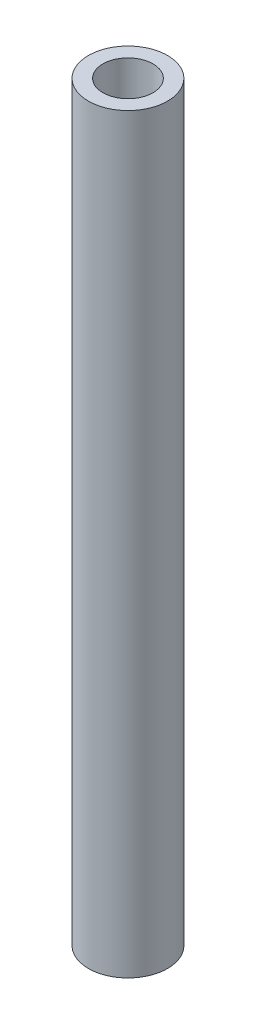
ISO-10303-21;
HEADER;
FILE_DESCRIPTION(('STEP AP214'),'2;1');
FILE_NAME('part.step','',(''),(''),'','','');
FILE_SCHEMA(('AUTOMOTIVE_DESIGN { 1 0 10303 214 1 1 1 1 }'));
ENDSEC;
DATA;
#1=APPLICATION_CONTEXT('core data for automotive mechanical design processes');
#2=APPLICATION_PROTOCOL_DEFINITION('international standard','automotive_design',2000,#1);
#3=PRODUCT_CONTEXT('',#1,'mechanical');
#4=PRODUCT('Part','Part','',(#3));
#5=PRODUCT_RELATED_PRODUCT_CATEGORY('part','',(#4));
#6=PRODUCT_DEFINITION_FORMATION('','',#4);
#7=PRODUCT_DEFINITION_CONTEXT('part definition',#1,'design');
#8=PRODUCT_DEFINITION('design','',#6,#7);
#9=PRODUCT_DEFINITION_SHAPE('','',#8);
#10=(LENGTH_UNIT() NAMED_UNIT(*) SI_UNIT(.MILLI.,.METRE.));
#11=(NAMED_UNIT(*) PLANE_ANGLE_UNIT() SI_UNIT($,.RADIAN.));
#12=(NAMED_UNIT(*) SI_UNIT($,.STERADIAN.) SOLID_ANGLE_UNIT());
#13=UNCERTAINTY_MEASURE_WITH_UNIT(LENGTH_MEASURE(1.E-05),#10,'distance_accuracy_value','');
#14=(GEOMETRIC_REPRESENTATION_CONTEXT(3) GLOBAL_UNCERTAINTY_ASSIGNED_CONTEXT((#13)) GLOBAL_UNIT_ASSIGNED_CONTEXT((#10,
#11,#12)) REPRESENTATION_CONTEXT('',''));
#15=CARTESIAN_POINT('',(0.,0.,0.));
#16=DIRECTION('',(0.,0.,1.));
#17=DIRECTION('',(1.,0.,0.));
#18=AXIS2_PLACEMENT_3D('',#15,#16,#17);
#19=CARTESIAN_POINT('',(0.,60.,0.));
#20=DIRECTION('',(0.,1.,0.));
#21=DIRECTION('',(0.,0.,1.));
#22=AXIS2_PLACEMENT_3D('',#19,#20,#21);
#23=PLANE('',#22);
#24=CARTESIAN_POINT('',(0.,60.,0.));
#25=DIRECTION('',(0.,1.,0.));
#26=DIRECTION('',(0.,0.,1.));
#27=AXIS2_PLACEMENT_3D('',#24,#25,#26);
#28=CIRCLE('',#27,3.16);
#29=CARTESIAN_POINT('',(0.,60.,3.16));
#30=VERTEX_POINT('',#29);
#31=EDGE_CURVE('E10',#30,#30,#28,.T.);
#32=ORIENTED_EDGE('',*,*,#31,.T.);
#33=EDGE_LOOP('',(#32));
#34=FACE_BOUND('',#33,.T.);
#35=CARTESIAN_POINT('',(0.,60.,0.));
#36=DIRECTION('',(0.,1.,0.));
#37=DIRECTION('',(0.,0.,1.));
#38=AXIS2_PLACEMENT_3D('',#35,#36,#37);
#39=CIRCLE('',#38,2.);
#40=CARTESIAN_POINT('',(0.,60.,2.));
#41=VERTEX_POINT('',#40);
#42=EDGE_CURVE('E50',#41,#41,#39,.T.);
#43=ORIENTED_EDGE('',*,*,#42,.F.);
#44=EDGE_LOOP('',(#43));
#45=FACE_BOUND('',#44,.T.);
#46=ADVANCED_FACE('F37',(#34,#45),#23,.T.);
#47=CARTESIAN_POINT('',(0.,0.,0.));
#48=DIRECTION('',(0.,1.,0.));
#49=DIRECTION('',(0.,0.,1.));
#50=AXIS2_PLACEMENT_3D('',#47,#48,#49);
#51=PLANE('',#50);
#52=CARTESIAN_POINT('',(0.,0.,0.));
#53=DIRECTION('',(0.,1.,0.));
#54=DIRECTION('',(0.,0.,1.));
#55=AXIS2_PLACEMENT_3D('',#52,#53,#54);
#56=CIRCLE('',#55,3.16);
#57=CARTESIAN_POINT('',(0.,0.,3.16));
#58=VERTEX_POINT('',#57);
#59=EDGE_CURVE('E41',#58,#58,#56,.T.);
#60=ORIENTED_EDGE('',*,*,#59,.F.);
#61=EDGE_LOOP('',(#60));
#62=FACE_BOUND('',#61,.T.);
#63=CARTESIAN_POINT('',(0.,0.,0.));
#64=DIRECTION('',(0.,1.,0.));
#65=DIRECTION('',(0.,0.,1.));
#66=AXIS2_PLACEMENT_3D('',#63,#64,#65);
#67=CIRCLE('',#66,2.);
#68=CARTESIAN_POINT('',(0.,0.,2.));
#69=VERTEX_POINT('',#68);
#70=EDGE_CURVE('E52',#69,#69,#67,.T.);
#71=ORIENTED_EDGE('',*,*,#70,.T.);
#72=EDGE_LOOP('',(#71));
#73=FACE_BOUND('',#72,.T.);
#74=ADVANCED_FACE('F64',(#62,#73),#51,.F.);
#75=CARTESIAN_POINT('',(0.,60.,0.));
#76=DIRECTION('',(0.,-1.,0.));
#77=DIRECTION('',(0.,0.,-1.));
#78=AXIS2_PLACEMENT_3D('',#75,#76,#77);
#79=CYLINDRICAL_SURFACE('',#78,3.16);
#80=ORIENTED_EDGE('',*,*,#31,.F.);
#81=EDGE_LOOP('',(#80));
#82=FACE_BOUND('',#81,.T.);
#83=ORIENTED_EDGE('',*,*,#59,.T.);
#84=EDGE_LOOP('',(#83));
#85=FACE_BOUND('',#84,.T.);
#86=ADVANCED_FACE('F39',(#82,#85),#79,.T.);
#87=CARTESIAN_POINT('',(0.,60.,0.));
#88=DIRECTION('',(0.,-1.,0.));
#89=DIRECTION('',(0.,0.,-1.));
#90=AXIS2_PLACEMENT_3D('',#87,#88,#89);
#91=CYLINDRICAL_SURFACE('',#90,2.);
#92=ORIENTED_EDGE('',*,*,#42,.T.);
#93=EDGE_LOOP('',(#92));
#94=FACE_BOUND('',#93,.T.);
#95=ORIENTED_EDGE('',*,*,#70,.F.);
#96=EDGE_LOOP('',(#95));
#97=FACE_BOUND('',#96,.T.);
#98=ADVANCED_FACE('F60',(#94,#97),#91,.F.);
#99=CLOSED_SHELL('',(#46,#74,#86,#98));
#100=MANIFOLD_SOLID_BREP('B2',#99);
#101=ADVANCED_BREP_SHAPE_REPRESENTATION('',(#18,#100),#14);
#102=SHAPE_DEFINITION_REPRESENTATION(#9,#101);
ENDSEC;
END-ISO-10303-21;
